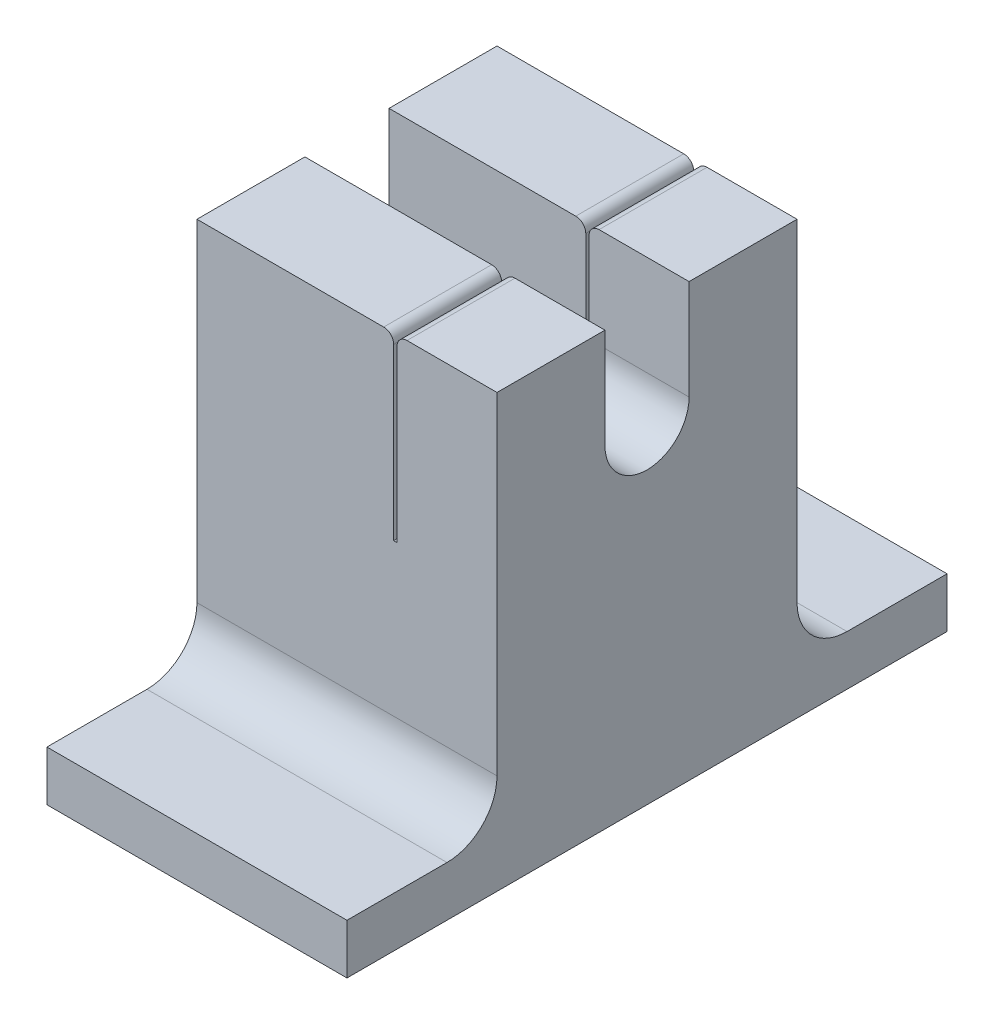
ISO-10303-21;
HEADER;
FILE_DESCRIPTION(('STEP AP214'),'2;1');
FILE_NAME('part.step','',(''),(''),'','','');
FILE_SCHEMA(('AUTOMOTIVE_DESIGN { 1 0 10303 214 1 1 1 1 }'));
ENDSEC;
DATA;
#1=APPLICATION_CONTEXT('core data for automotive mechanical design processes');
#2=APPLICATION_PROTOCOL_DEFINITION('international standard','automotive_design',2000,#1);
#3=PRODUCT_CONTEXT('',#1,'mechanical');
#4=PRODUCT('Part','Part','',(#3));
#5=PRODUCT_RELATED_PRODUCT_CATEGORY('part','',(#4));
#6=PRODUCT_DEFINITION_FORMATION('','',#4);
#7=PRODUCT_DEFINITION_CONTEXT('part definition',#1,'design');
#8=PRODUCT_DEFINITION('design','',#6,#7);
#9=PRODUCT_DEFINITION_SHAPE('','',#8);
#10=(LENGTH_UNIT() NAMED_UNIT(*) SI_UNIT(.MILLI.,.METRE.));
#11=(NAMED_UNIT(*) PLANE_ANGLE_UNIT() SI_UNIT($,.RADIAN.));
#12=(NAMED_UNIT(*) SI_UNIT($,.STERADIAN.) SOLID_ANGLE_UNIT());
#13=UNCERTAINTY_MEASURE_WITH_UNIT(LENGTH_MEASURE(1.E-05),#10,'distance_accuracy_value','');
#14=(GEOMETRIC_REPRESENTATION_CONTEXT(3) GLOBAL_UNCERTAINTY_ASSIGNED_CONTEXT((#13)) GLOBAL_UNIT_ASSIGNED_CONTEXT((#10,
#11,#12)) REPRESENTATION_CONTEXT('',''));
#15=CARTESIAN_POINT('',(0.,0.,0.));
#16=DIRECTION('',(0.,0.,1.));
#17=DIRECTION('',(1.,0.,0.));
#18=AXIS2_PLACEMENT_3D('',#15,#16,#17);
#19=CARTESIAN_POINT('',(15.,33.2,0.));
#20=DIRECTION('',(-1.,0.,0.));
#21=DIRECTION('',(0.,0.,1.));
#22=AXIS2_PLACEMENT_3D('',#19,#20,#21);
#23=CYLINDRICAL_SURFACE('',#22,4.205);
#24=DIRECTION('',(-1.,0.,0.));
#25=VECTOR('',#24,1.);
#26=CARTESIAN_POINT('',(15.,33.2,-4.205));
#27=LINE('',#26,#25);
#28=CARTESIAN_POINT('',(5.,33.2,-4.205));
#29=VERTEX_POINT('',#28);
#30=CARTESIAN_POINT('',(15.,33.2,-4.205));
#31=VERTEX_POINT('',#30);
#32=EDGE_CURVE('E351',#29,#31,#27,.F.);
#33=ORIENTED_EDGE('',*,*,#32,.F.);
#34=CARTESIAN_POINT('',(5.,33.2,0.));
#35=DIRECTION('',(1.,0.,0.));
#36=DIRECTION('',(0.,0.,-1.));
#37=AXIS2_PLACEMENT_3D('',#34,#35,#36);
#38=CIRCLE('',#37,4.205);
#39=CARTESIAN_POINT('',(5.,33.2,4.205));
#40=VERTEX_POINT('',#39);
#41=EDGE_CURVE('E258',#29,#40,#38,.F.);
#42=ORIENTED_EDGE('',*,*,#41,.T.);
#43=DIRECTION('',(-1.,0.,0.));
#44=VECTOR('',#43,1.);
#45=CARTESIAN_POINT('',(15.,33.2,4.205));
#46=LINE('',#45,#44);
#47=CARTESIAN_POINT('',(15.,33.2,4.205));
#48=VERTEX_POINT('',#47);
#49=EDGE_CURVE('E356',#48,#40,#46,.T.);
#50=ORIENTED_EDGE('',*,*,#49,.F.);
#51=CARTESIAN_POINT('',(15.,33.2,0.));
#52=DIRECTION('',(-1.,0.,0.));
#53=DIRECTION('',(0.,0.,1.));
#54=AXIS2_PLACEMENT_3D('',#51,#52,#53);
#55=CIRCLE('',#54,4.205);
#56=EDGE_CURVE('E330',#31,#48,#55,.T.);
#57=ORIENTED_EDGE('',*,*,#56,.F.);
#58=EDGE_LOOP('',(#33,#42,#50,#57));
#59=FACE_BOUND('',#58,.T.);
#60=ADVANCED_FACE('F39',(#59),#23,.F.);
#61=CARTESIAN_POINT('',(-15.,43.2,-4.205));
#62=DIRECTION('',(0.,0.,-1.));
#63=DIRECTION('',(-1.,0.,0.));
#64=AXIS2_PLACEMENT_3D('',#61,#62,#63);
#65=PLANE('',#64);
#66=DIRECTION('',(1.,0.,0.));
#67=VECTOR('',#66,1.);
#68=CARTESIAN_POINT('',(-15.,43.2,-4.205));
#69=LINE('',#68,#67);
#70=CARTESIAN_POINT('',(6.,43.2,-4.205));
#71=VERTEX_POINT('',#70);
#72=CARTESIAN_POINT('',(15.,43.2,-4.205));
#73=VERTEX_POINT('',#72);
#74=EDGE_CURVE('E287',#71,#73,#69,.T.);
#75=ORIENTED_EDGE('',*,*,#74,.F.);
#76=CARTESIAN_POINT('',(6.,42.2,-4.205));
#77=DIRECTION('',(0.,0.,-1.));
#78=DIRECTION('',(-1.,0.,0.));
#79=AXIS2_PLACEMENT_3D('',#76,#77,#78);
#80=CIRCLE('',#79,1.);
#81=CARTESIAN_POINT('',(5.,42.2,-4.205));
#82=VERTEX_POINT('',#81);
#83=EDGE_CURVE('E404',#71,#82,#80,.F.);
#84=ORIENTED_EDGE('',*,*,#83,.T.);
#85=DIRECTION('',(0.,-1.,0.));
#86=VECTOR('',#85,1.);
#87=CARTESIAN_POINT('',(5.,43.2,-4.205));
#88=LINE('',#87,#86);
#89=EDGE_CURVE('E261',#82,#29,#88,.T.);
#90=ORIENTED_EDGE('',*,*,#89,.T.);
#91=ORIENTED_EDGE('',*,*,#32,.T.);
#92=DIRECTION('',(0.,-1.,0.));
#93=VECTOR('',#92,1.);
#94=CARTESIAN_POINT('',(15.,43.2,-4.205));
#95=LINE('',#94,#93);
#96=EDGE_CURVE('E293',#73,#31,#95,.T.);
#97=ORIENTED_EDGE('',*,*,#96,.F.);
#98=EDGE_LOOP('',(#75,#84,#90,#91,#97));
#99=FACE_BOUND('',#98,.T.);
#100=ADVANCED_FACE('F407',(#99),#65,.F.);
#101=CARTESIAN_POINT('',(0.,43.2,0.));
#102=DIRECTION('',(0.,1.,0.));
#103=DIRECTION('',(0.,0.,1.));
#104=AXIS2_PLACEMENT_3D('',#101,#102,#103);
#105=PLANE('',#104);
#106=DIRECTION('',(-1.,0.,0.));
#107=VECTOR('',#106,1.);
#108=CARTESIAN_POINT('',(15.,43.2,-15.));
#109=LINE('',#108,#107);
#110=CARTESIAN_POINT('',(15.,43.2,-15.));
#111=VERTEX_POINT('',#110);
#112=CARTESIAN_POINT('',(6.,43.2,-15.));
#113=VERTEX_POINT('',#112);
#114=EDGE_CURVE('E283',#111,#113,#109,.T.);
#115=ORIENTED_EDGE('',*,*,#114,.T.);
#116=DIRECTION('',(0.,0.,-1.));
#117=VECTOR('',#116,1.);
#118=CARTESIAN_POINT('',(6.,43.2,-4.205));
#119=LINE('',#118,#117);
#120=EDGE_CURVE('E61',#113,#71,#119,.F.);
#121=ORIENTED_EDGE('',*,*,#120,.T.);
#122=ORIENTED_EDGE('',*,*,#74,.T.);
#123=DIRECTION('',(0.,0.,-1.));
#124=VECTOR('',#123,1.);
#125=CARTESIAN_POINT('',(15.,43.2,-4.205));
#126=LINE('',#125,#124);
#127=EDGE_CURVE('E290',#73,#111,#126,.T.);
#128=ORIENTED_EDGE('',*,*,#127,.T.);
#129=EDGE_LOOP('',(#115,#121,#122,#128));
#130=FACE_BOUND('',#129,.T.);
#131=ADVANCED_FACE('F414',(#130),#105,.T.);
#132=CARTESIAN_POINT('',(15.,43.2,4.205));
#133=DIRECTION('',(0.,0.,1.));
#134=DIRECTION('',(1.,0.,0.));
#135=AXIS2_PLACEMENT_3D('',#132,#133,#134);
#136=PLANE('',#135);
#137=DIRECTION('',(0.,1.,0.));
#138=VECTOR('',#137,1.);
#139=CARTESIAN_POINT('',(5.,43.2,4.205));
#140=LINE('',#139,#138);
#141=CARTESIAN_POINT('',(5.,42.2,4.205));
#142=VERTEX_POINT('',#141);
#143=EDGE_CURVE('E255',#40,#142,#140,.T.);
#144=ORIENTED_EDGE('',*,*,#143,.T.);
#145=CARTESIAN_POINT('',(6.,42.2,4.205));
#146=DIRECTION('',(0.,0.,1.));
#147=DIRECTION('',(1.,0.,0.));
#148=AXIS2_PLACEMENT_3D('',#145,#146,#147);
#149=CIRCLE('',#148,1.);
#150=CARTESIAN_POINT('',(6.,43.2,4.205));
#151=VERTEX_POINT('',#150);
#152=EDGE_CURVE('E395',#142,#151,#149,.F.);
#153=ORIENTED_EDGE('',*,*,#152,.T.);
#154=DIRECTION('',(-1.,0.,0.));
#155=VECTOR('',#154,1.);
#156=CARTESIAN_POINT('',(15.,43.2,4.205));
#157=LINE('',#156,#155);
#158=CARTESIAN_POINT('',(15.,43.2,4.205));
#159=VERTEX_POINT('',#158);
#160=EDGE_CURVE('E273',#159,#151,#157,.T.);
#161=ORIENTED_EDGE('',*,*,#160,.F.);
#162=DIRECTION('',(0.,-1.,0.));
#163=VECTOR('',#162,1.);
#164=CARTESIAN_POINT('',(15.,43.2,4.205));
#165=LINE('',#164,#163);
#166=EDGE_CURVE('E263',#159,#48,#165,.T.);
#167=ORIENTED_EDGE('',*,*,#166,.T.);
#168=ORIENTED_EDGE('',*,*,#49,.T.);
#169=EDGE_LOOP('',(#144,#153,#161,#167,#168));
#170=FACE_BOUND('',#169,.T.);
#171=ADVANCED_FACE('F470',(#170),#136,.F.);
#172=CARTESIAN_POINT('',(0.,43.2,0.));
#173=DIRECTION('',(0.,1.,0.));
#174=DIRECTION('',(0.,0.,1.));
#175=AXIS2_PLACEMENT_3D('',#172,#173,#174);
#176=PLANE('',#175);
#177=ORIENTED_EDGE('',*,*,#160,.T.);
#178=DIRECTION('',(0.,0.,-1.));
#179=VECTOR('',#178,1.);
#180=CARTESIAN_POINT('',(6.,43.2,15.));
#181=LINE('',#180,#179);
#182=CARTESIAN_POINT('',(6.00000000000001,43.2,15.));
#183=VERTEX_POINT('',#182);
#184=EDGE_CURVE('E397',#151,#183,#181,.F.);
#185=ORIENTED_EDGE('',*,*,#184,.T.);
#186=DIRECTION('',(1.,0.,0.));
#187=VECTOR('',#186,1.);
#188=CARTESIAN_POINT('',(-15.,43.2,15.));
#189=LINE('',#188,#187);
#190=CARTESIAN_POINT('',(15.,43.2,15.));
#191=VERTEX_POINT('',#190);
#192=EDGE_CURVE('E278',#183,#191,#189,.T.);
#193=ORIENTED_EDGE('',*,*,#192,.T.);
#194=DIRECTION('',(0.,0.,-1.));
#195=VECTOR('',#194,1.);
#196=CARTESIAN_POINT('',(15.,43.2,15.));
#197=LINE('',#196,#195);
#198=EDGE_CURVE('E276',#191,#159,#197,.T.);
#199=ORIENTED_EDGE('',*,*,#198,.T.);
#200=EDGE_LOOP('',(#177,#185,#193,#199));
#201=FACE_BOUND('',#200,.T.);
#202=ADVANCED_FACE('F463',(#201),#176,.T.);
#203=CARTESIAN_POINT('',(-15.,33.2,15.));
#204=DIRECTION('',(1.,0.,0.));
#205=DIRECTION('',(0.,0.,-1.));
#206=AXIS2_PLACEMENT_3D('',#203,#204,#205);
#207=PLANE('',#206);
#208=DIRECTION('',(0.,-1.,0.));
#209=VECTOR('',#208,1.);
#210=CARTESIAN_POINT('',(-15.,33.2,-15.));
#211=LINE('',#210,#209);
#212=CARTESIAN_POINT('',(-15.,43.2,-15.));
#213=VERTEX_POINT('',#212);
#214=CARTESIAN_POINT('',(-15.,10.,-15.));
#215=VERTEX_POINT('',#214);
#216=EDGE_CURVE('E339',#213,#215,#211,.T.);
#217=ORIENTED_EDGE('',*,*,#216,.T.);
#218=CARTESIAN_POINT('',(-15.,10.,-20.));
#219=DIRECTION('',(1.,0.,0.));
#220=DIRECTION('',(0.,0.,-1.));
#221=AXIS2_PLACEMENT_3D('',#218,#219,#220);
#222=CIRCLE('',#221,5.);
#223=CARTESIAN_POINT('',(-15.,5.00000000000001,-20.));
#224=VERTEX_POINT('',#223);
#225=EDGE_CURVE('E369',#215,#224,#222,.T.);
#226=ORIENTED_EDGE('',*,*,#225,.T.);
#227=DIRECTION('',(0.,0.,-1.));
#228=VECTOR('',#227,1.);
#229=CARTESIAN_POINT('',(-15.,5.,30.));
#230=LINE('',#229,#228);
#231=CARTESIAN_POINT('',(-15.,5.00000000000001,-30.));
#232=VERTEX_POINT('',#231);
#233=EDGE_CURVE('E303',#224,#232,#230,.T.);
#234=ORIENTED_EDGE('',*,*,#233,.T.);
#235=DIRECTION('',(0.,-1.,0.));
#236=VECTOR('',#235,1.);
#237=CARTESIAN_POINT('',(-15.,0.,-30.));
#238=LINE('',#237,#236);
#239=CARTESIAN_POINT('',(-15.,0.,-30.));
#240=VERTEX_POINT('',#239);
#241=EDGE_CURVE('E300',#232,#240,#238,.T.);
#242=ORIENTED_EDGE('',*,*,#241,.T.);
#243=DIRECTION('',(0.,0.,1.));
#244=VECTOR('',#243,1.);
#245=CARTESIAN_POINT('',(-15.,0.,15.));
#246=LINE('',#245,#244);
#247=CARTESIAN_POINT('',(-15.,0.,30.));
#248=VERTEX_POINT('',#247);
#249=EDGE_CURVE('E333',#240,#248,#246,.T.);
#250=ORIENTED_EDGE('',*,*,#249,.T.);
#251=DIRECTION('',(0.,1.,0.));
#252=VECTOR('',#251,1.);
#253=CARTESIAN_POINT('',(-15.,0.,30.));
#254=LINE('',#253,#252);
#255=CARTESIAN_POINT('',(-15.,5.,30.));
#256=VERTEX_POINT('',#255);
#257=EDGE_CURVE('E308',#248,#256,#254,.T.);
#258=ORIENTED_EDGE('',*,*,#257,.T.);
#259=CARTESIAN_POINT('',(-15.,5.,20.));
#260=VERTEX_POINT('',#259);
#261=EDGE_CURVE('E305',#256,#260,#230,.T.);
#262=ORIENTED_EDGE('',*,*,#261,.T.);
#263=CARTESIAN_POINT('',(-15.,10.,20.));
#264=DIRECTION('',(1.,0.,0.));
#265=DIRECTION('',(0.,0.,-1.));
#266=AXIS2_PLACEMENT_3D('',#263,#264,#265);
#267=CIRCLE('',#266,5.);
#268=CARTESIAN_POINT('',(-15.,10.,15.));
#269=VERTEX_POINT('',#268);
#270=EDGE_CURVE('E375',#260,#269,#267,.T.);
#271=ORIENTED_EDGE('',*,*,#270,.T.);
#272=DIRECTION('',(0.,-1.,0.));
#273=VECTOR('',#272,1.);
#274=CARTESIAN_POINT('',(-15.,33.2,15.));
#275=LINE('',#274,#273);
#276=CARTESIAN_POINT('',(-15.,43.2,15.));
#277=VERTEX_POINT('',#276);
#278=EDGE_CURVE('E348',#277,#269,#275,.T.);
#279=ORIENTED_EDGE('',*,*,#278,.F.);
#280=DIRECTION('',(0.,0.,1.));
#281=VECTOR('',#280,1.);
#282=CARTESIAN_POINT('',(-15.,43.2,4.205));
#283=LINE('',#282,#281);
#284=CARTESIAN_POINT('',(-15.,43.2,4.205));
#285=VERTEX_POINT('',#284);
#286=EDGE_CURVE('E269',#285,#277,#283,.T.);
#287=ORIENTED_EDGE('',*,*,#286,.F.);
#288=DIRECTION('',(0.,-1.,0.));
#289=VECTOR('',#288,1.);
#290=CARTESIAN_POINT('',(-15.,43.2,4.205));
#291=LINE('',#290,#289);
#292=CARTESIAN_POINT('',(-15.,33.2,4.205));
#293=VERTEX_POINT('',#292);
#294=EDGE_CURVE('E266',#285,#293,#291,.T.);
#295=ORIENTED_EDGE('',*,*,#294,.T.);
#296=CARTESIAN_POINT('',(-15.,33.2,0.));
#297=DIRECTION('',(-1.,0.,0.));
#298=DIRECTION('',(0.,0.,1.));
#299=AXIS2_PLACEMENT_3D('',#296,#297,#298);
#300=CIRCLE('',#299,4.205);
#301=CARTESIAN_POINT('',(-15.,33.2,-4.205));
#302=VERTEX_POINT('',#301);
#303=EDGE_CURVE('E310',#302,#293,#300,.T.);
#304=ORIENTED_EDGE('',*,*,#303,.F.);
#305=DIRECTION('',(0.,-1.,0.));
#306=VECTOR('',#305,1.);
#307=CARTESIAN_POINT('',(-15.,43.2,-4.205));
#308=LINE('',#307,#306);
#309=CARTESIAN_POINT('',(-15.,43.2,-4.205));
#310=VERTEX_POINT('',#309);
#311=EDGE_CURVE('E296',#310,#302,#308,.T.);
#312=ORIENTED_EDGE('',*,*,#311,.F.);
#313=DIRECTION('',(0.,0.,1.));
#314=VECTOR('',#313,1.);
#315=CARTESIAN_POINT('',(-15.,43.2,-15.));
#316=LINE('',#315,#314);
#317=EDGE_CURVE('E285',#213,#310,#316,.T.);
#318=ORIENTED_EDGE('',*,*,#317,.F.);
#319=EDGE_LOOP('',(#217,#226,#234,#242,#250,#258,#262,#271,#279,#287,#295,#304,#312,#318));
#320=FACE_BOUND('',#319,.T.);
#321=ADVANCED_FACE('F426',(#320),#207,.F.);
#322=CARTESIAN_POINT('',(-15.,33.2,15.));
#323=DIRECTION('',(0.,0.,-1.));
#324=DIRECTION('',(-1.,0.,0.));
#325=AXIS2_PLACEMENT_3D('',#322,#323,#324);
#326=PLANE('',#325);
#327=DIRECTION('',(0.,1.,0.));
#328=VECTOR('',#327,1.);
#329=CARTESIAN_POINT('',(4.67,25.2,15.));
#330=LINE('',#329,#328);
#331=CARTESIAN_POINT('',(4.67,25.2,15.));
#332=VERTEX_POINT('',#331);
#333=CARTESIAN_POINT('',(4.67,42.2,15.));
#334=VERTEX_POINT('',#333);
#335=EDGE_CURVE('E245',#332,#334,#330,.T.);
#336=ORIENTED_EDGE('',*,*,#335,.T.);
#337=CARTESIAN_POINT('',(3.67,42.2,15.));
#338=DIRECTION('',(0.,0.,-1.));
#339=DIRECTION('',(-1.,0.,0.));
#340=AXIS2_PLACEMENT_3D('',#337,#338,#339);
#341=CIRCLE('',#340,1.);
#342=CARTESIAN_POINT('',(3.67,43.2,15.));
#343=VERTEX_POINT('',#342);
#344=EDGE_CURVE('E385',#334,#343,#341,.F.);
#345=ORIENTED_EDGE('',*,*,#344,.T.);
#346=EDGE_CURVE('E279',#277,#343,#189,.T.);
#347=ORIENTED_EDGE('',*,*,#346,.F.);
#348=ORIENTED_EDGE('',*,*,#278,.T.);
#349=DIRECTION('',(1.,0.,0.));
#350=VECTOR('',#349,1.);
#351=CARTESIAN_POINT('',(-15.,10.,15.));
#352=LINE('',#351,#350);
#353=CARTESIAN_POINT('',(15.,10.,15.));
#354=VERTEX_POINT('',#353);
#355=EDGE_CURVE('E364',#269,#354,#352,.T.);
#356=ORIENTED_EDGE('',*,*,#355,.T.);
#357=DIRECTION('',(0.,-1.,0.));
#358=VECTOR('',#357,1.);
#359=CARTESIAN_POINT('',(15.,33.2,15.));
#360=LINE('',#359,#358);
#361=EDGE_CURVE('E345',#191,#354,#360,.T.);
#362=ORIENTED_EDGE('',*,*,#361,.F.);
#363=ORIENTED_EDGE('',*,*,#192,.F.);
#364=CARTESIAN_POINT('',(6.,42.2,15.));
#365=DIRECTION('',(0.,0.,-1.));
#366=DIRECTION('',(-1.,0.,0.));
#367=AXIS2_PLACEMENT_3D('',#364,#365,#366);
#368=CIRCLE('',#367,1.);
#369=CARTESIAN_POINT('',(5.,42.2,15.));
#370=VERTEX_POINT('',#369);
#371=EDGE_CURVE('E383',#183,#370,#368,.F.);
#372=ORIENTED_EDGE('',*,*,#371,.T.);
#373=DIRECTION('',(0.,1.,0.));
#374=VECTOR('',#373,1.);
#375=CARTESIAN_POINT('',(5.,25.2,15.));
#376=LINE('',#375,#374);
#377=CARTESIAN_POINT('',(5.,25.2,15.));
#378=VERTEX_POINT('',#377);
#379=EDGE_CURVE('E242',#378,#370,#376,.T.);
#380=ORIENTED_EDGE('',*,*,#379,.F.);
#381=DIRECTION('',(1.,0.,0.));
#382=VECTOR('',#381,1.);
#383=CARTESIAN_POINT('',(4.67,25.2,15.));
#384=LINE('',#383,#382);
#385=EDGE_CURVE('E224',#332,#378,#384,.T.);
#386=ORIENTED_EDGE('',*,*,#385,.F.);
#387=EDGE_LOOP('',(#336,#345,#347,#348,#356,#362,#363,#372,#380,#386));
#388=FACE_BOUND('',#387,.T.);
#389=ADVANCED_FACE('F456',(#388),#326,.F.);
#390=CARTESIAN_POINT('',(15.,33.2,15.));
#391=DIRECTION('',(-1.,0.,0.));
#392=DIRECTION('',(0.,0.,1.));
#393=AXIS2_PLACEMENT_3D('',#390,#391,#392);
#394=PLANE('',#393);
#395=ORIENTED_EDGE('',*,*,#361,.T.);
#396=CARTESIAN_POINT('',(15.,10.,20.));
#397=DIRECTION('',(-1.,0.,0.));
#398=DIRECTION('',(0.,0.,1.));
#399=AXIS2_PLACEMENT_3D('',#396,#397,#398);
#400=CIRCLE('',#399,5.);
#401=CARTESIAN_POINT('',(15.,5.,20.));
#402=VERTEX_POINT('',#401);
#403=EDGE_CURVE('E373',#354,#402,#400,.T.);
#404=ORIENTED_EDGE('',*,*,#403,.T.);
#405=DIRECTION('',(0.,0.,1.));
#406=VECTOR('',#405,1.);
#407=CARTESIAN_POINT('',(15.,5.,30.));
#408=LINE('',#407,#406);
#409=CARTESIAN_POINT('',(15.,5.,30.));
#410=VERTEX_POINT('',#409);
#411=EDGE_CURVE('E316',#402,#410,#408,.T.);
#412=ORIENTED_EDGE('',*,*,#411,.T.);
#413=DIRECTION('',(0.,-1.,0.));
#414=VECTOR('',#413,1.);
#415=CARTESIAN_POINT('',(15.,0.,30.));
#416=LINE('',#415,#414);
#417=CARTESIAN_POINT('',(15.,0.,30.));
#418=VERTEX_POINT('',#417);
#419=EDGE_CURVE('E299',#410,#418,#416,.T.);
#420=ORIENTED_EDGE('',*,*,#419,.T.);
#421=DIRECTION('',(0.,0.,-1.));
#422=VECTOR('',#421,1.);
#423=CARTESIAN_POINT('',(15.,0.,15.));
#424=LINE('',#423,#422);
#425=CARTESIAN_POINT('',(15.,0.,-30.));
#426=VERTEX_POINT('',#425);
#427=EDGE_CURVE('E337',#418,#426,#424,.T.);
#428=ORIENTED_EDGE('',*,*,#427,.T.);
#429=DIRECTION('',(0.,1.,0.));
#430=VECTOR('',#429,1.);
#431=CARTESIAN_POINT('',(15.,0.,-30.));
#432=LINE('',#431,#430);
#433=CARTESIAN_POINT('',(15.,5.00000000000001,-30.));
#434=VERTEX_POINT('',#433);
#435=EDGE_CURVE('E313',#426,#434,#432,.T.);
#436=ORIENTED_EDGE('',*,*,#435,.T.);
#437=CARTESIAN_POINT('',(15.,5.00000000000001,-20.));
#438=VERTEX_POINT('',#437);
#439=EDGE_CURVE('E317',#434,#438,#408,.T.);
#440=ORIENTED_EDGE('',*,*,#439,.T.);
#441=CARTESIAN_POINT('',(15.,10.,-20.));
#442=DIRECTION('',(-1.,0.,0.));
#443=DIRECTION('',(0.,0.,1.));
#444=AXIS2_PLACEMENT_3D('',#441,#442,#443);
#445=CIRCLE('',#444,5.);
#446=CARTESIAN_POINT('',(15.,10.,-15.));
#447=VERTEX_POINT('',#446);
#448=EDGE_CURVE('E371',#438,#447,#445,.T.);
#449=ORIENTED_EDGE('',*,*,#448,.T.);
#450=DIRECTION('',(0.,-1.,0.));
#451=VECTOR('',#450,1.);
#452=CARTESIAN_POINT('',(15.,33.2,-15.));
#453=LINE('',#452,#451);
#454=EDGE_CURVE('E342',#111,#447,#453,.T.);
#455=ORIENTED_EDGE('',*,*,#454,.F.);
#456=ORIENTED_EDGE('',*,*,#127,.F.);
#457=ORIENTED_EDGE('',*,*,#96,.T.);
#458=ORIENTED_EDGE('',*,*,#56,.T.);
#459=ORIENTED_EDGE('',*,*,#166,.F.);
#460=ORIENTED_EDGE('',*,*,#198,.F.);
#461=EDGE_LOOP('',(#395,#404,#412,#420,#428,#436,#440,#449,#455,#456,#457,#458,#459,#460));
#462=FACE_BOUND('',#461,.T.);
#463=ADVANCED_FACE('F417',(#462),#394,.F.);
#464=CARTESIAN_POINT('',(-15.,33.2,-15.));
#465=DIRECTION('',(0.,0.,1.));
#466=DIRECTION('',(1.,0.,0.));
#467=AXIS2_PLACEMENT_3D('',#464,#465,#466);
#468=PLANE('',#467);
#469=DIRECTION('',(0.,1.,0.));
#470=VECTOR('',#469,1.);
#471=CARTESIAN_POINT('',(5.,25.2,-15.));
#472=LINE('',#471,#470);
#473=CARTESIAN_POINT('',(5.,25.2,-15.));
#474=VERTEX_POINT('',#473);
#475=CARTESIAN_POINT('',(5.,42.2,-15.));
#476=VERTEX_POINT('',#475);
#477=EDGE_CURVE('E212',#474,#476,#472,.T.);
#478=ORIENTED_EDGE('',*,*,#477,.T.);
#479=CARTESIAN_POINT('',(6.,42.2,-15.));
#480=DIRECTION('',(0.,0.,1.));
#481=DIRECTION('',(1.,0.,0.));
#482=AXIS2_PLACEMENT_3D('',#479,#480,#481);
#483=CIRCLE('',#482,1.);
#484=EDGE_CURVE('E401',#476,#113,#483,.F.);
#485=ORIENTED_EDGE('',*,*,#484,.T.);
#486=ORIENTED_EDGE('',*,*,#114,.F.);
#487=ORIENTED_EDGE('',*,*,#454,.T.);
#488=DIRECTION('',(-1.,0.,0.));
#489=VECTOR('',#488,1.);
#490=CARTESIAN_POINT('',(-15.,10.,-15.));
#491=LINE('',#490,#489);
#492=EDGE_CURVE('E359',#447,#215,#491,.T.);
#493=ORIENTED_EDGE('',*,*,#492,.T.);
#494=ORIENTED_EDGE('',*,*,#216,.F.);
#495=CARTESIAN_POINT('',(3.67,43.2,-15.));
#496=VERTEX_POINT('',#495);
#497=EDGE_CURVE('E282',#496,#213,#109,.T.);
#498=ORIENTED_EDGE('',*,*,#497,.F.);
#499=CARTESIAN_POINT('',(3.67,42.2,-15.));
#500=DIRECTION('',(0.,0.,1.));
#501=DIRECTION('',(1.,0.,0.));
#502=AXIS2_PLACEMENT_3D('',#499,#500,#501);
#503=CIRCLE('',#502,1.);
#504=CARTESIAN_POINT('',(4.67,42.2,-15.));
#505=VERTEX_POINT('',#504);
#506=EDGE_CURVE('E399',#496,#505,#503,.F.);
#507=ORIENTED_EDGE('',*,*,#506,.T.);
#508=DIRECTION('',(0.,1.,0.));
#509=VECTOR('',#508,1.);
#510=CARTESIAN_POINT('',(4.67,25.2,-15.));
#511=LINE('',#510,#509);
#512=CARTESIAN_POINT('',(4.67,25.2,-15.));
#513=VERTEX_POINT('',#512);
#514=EDGE_CURVE('E223',#513,#505,#511,.T.);
#515=ORIENTED_EDGE('',*,*,#514,.F.);
#516=DIRECTION('',(-1.,0.,0.));
#517=VECTOR('',#516,1.);
#518=CARTESIAN_POINT('',(4.67,25.2,-15.));
#519=LINE('',#518,#517);
#520=EDGE_CURVE('E230',#474,#513,#519,.T.);
#521=ORIENTED_EDGE('',*,*,#520,.F.);
#522=EDGE_LOOP('',(#478,#485,#486,#487,#493,#494,#498,#507,#515,#521));
#523=FACE_BOUND('',#522,.T.);
#524=ADVANCED_FACE('F235',(#523),#468,.F.);
#525=CARTESIAN_POINT('',(0.,0.,0.));
#526=DIRECTION('',(0.,-1.,0.));
#527=DIRECTION('',(0.,0.,-1.));
#528=AXIS2_PLACEMENT_3D('',#525,#526,#527);
#529=PLANE('',#528);
#530=ORIENTED_EDGE('',*,*,#249,.F.);
#531=DIRECTION('',(1.,0.,0.));
#532=VECTOR('',#531,1.);
#533=CARTESIAN_POINT('',(-75.2079728939615,0.,-30.));
#534=LINE('',#533,#532);
#535=EDGE_CURVE('E325',#240,#426,#534,.T.);
#536=ORIENTED_EDGE('',*,*,#535,.T.);
#537=ORIENTED_EDGE('',*,*,#427,.F.);
#538=DIRECTION('',(1.,0.,0.));
#539=VECTOR('',#538,1.);
#540=CARTESIAN_POINT('',(-75.2079728939615,0.,30.));
#541=LINE('',#540,#539);
#542=EDGE_CURVE('E320',#248,#418,#541,.T.);
#543=ORIENTED_EDGE('',*,*,#542,.F.);
#544=EDGE_LOOP('',(#530,#536,#537,#543));
#545=FACE_BOUND('',#544,.T.);
#546=ADVANCED_FACE('F440',(#545),#529,.T.);
#547=CARTESIAN_POINT('',(4.67,33.2,4.205));
#548=VERTEX_POINT('',#547);
#549=EDGE_CURVE('E355',#548,#293,#46,.T.);
#550=ORIENTED_EDGE('',*,*,#549,.F.);
#551=CARTESIAN_POINT('',(4.67,33.2,0.));
#552=DIRECTION('',(-1.,0.,0.));
#553=DIRECTION('',(0.,0.,1.));
#554=AXIS2_PLACEMENT_3D('',#551,#552,#553);
#555=CIRCLE('',#554,4.205);
#556=CARTESIAN_POINT('',(4.67,33.2,-4.205));
#557=VERTEX_POINT('',#556);
#558=EDGE_CURVE('E250',#548,#557,#555,.F.);
#559=ORIENTED_EDGE('',*,*,#558,.T.);
#560=EDGE_CURVE('E352',#302,#557,#27,.F.);
#561=ORIENTED_EDGE('',*,*,#560,.F.);
#562=ORIENTED_EDGE('',*,*,#303,.T.);
#563=EDGE_LOOP('',(#550,#559,#561,#562));
#564=FACE_BOUND('',#563,.T.);
#565=ADVANCED_FACE('F475',(#564),#23,.F.);
#566=CARTESIAN_POINT('',(-75.2079728939615,0.,-30.));
#567=DIRECTION('',(0.,0.,-1.));
#568=DIRECTION('',(-1.,0.,0.));
#569=AXIS2_PLACEMENT_3D('',#566,#567,#568);
#570=PLANE('',#569);
#571=ORIENTED_EDGE('',*,*,#241,.F.);
#572=DIRECTION('',(1.,0.,0.));
#573=VECTOR('',#572,1.);
#574=CARTESIAN_POINT('',(-75.2079728939615,5.00000000000001,-30.));
#575=LINE('',#574,#573);
#576=EDGE_CURVE('E323',#232,#434,#575,.T.);
#577=ORIENTED_EDGE('',*,*,#576,.T.);
#578=ORIENTED_EDGE('',*,*,#435,.F.);
#579=ORIENTED_EDGE('',*,*,#535,.F.);
#580=EDGE_LOOP('',(#571,#577,#578,#579));
#581=FACE_BOUND('',#580,.T.);
#582=ADVANCED_FACE('F435',(#581),#570,.T.);
#583=CARTESIAN_POINT('',(-75.2079728939615,5.,30.));
#584=DIRECTION('',(0.,1.,0.));
#585=DIRECTION('',(0.,0.,1.));
#586=AXIS2_PLACEMENT_3D('',#583,#584,#585);
#587=PLANE('',#586);
#588=ORIENTED_EDGE('',*,*,#233,.F.);
#589=DIRECTION('',(-1.,0.,0.));
#590=VECTOR('',#589,1.);
#591=CARTESIAN_POINT('',(-75.2079728939615,5.00000000000001,-20.));
#592=LINE('',#591,#590);
#593=EDGE_CURVE('E362',#224,#438,#592,.F.);
#594=ORIENTED_EDGE('',*,*,#593,.T.);
#595=ORIENTED_EDGE('',*,*,#439,.F.);
#596=ORIENTED_EDGE('',*,*,#576,.F.);
#597=EDGE_LOOP('',(#588,#594,#595,#596));
#598=FACE_BOUND('',#597,.T.);
#599=ADVANCED_FACE('F431',(#598),#587,.T.);
#600=ORIENTED_EDGE('',*,*,#411,.F.);
#601=DIRECTION('',(1.,0.,0.));
#602=VECTOR('',#601,1.);
#603=CARTESIAN_POINT('',(-75.2079728939615,5.,20.));
#604=LINE('',#603,#602);
#605=EDGE_CURVE('E367',#402,#260,#604,.F.);
#606=ORIENTED_EDGE('',*,*,#605,.T.);
#607=ORIENTED_EDGE('',*,*,#261,.F.);
#608=DIRECTION('',(1.,0.,0.));
#609=VECTOR('',#608,1.);
#610=CARTESIAN_POINT('',(-75.2079728939615,5.,30.));
#611=LINE('',#610,#609);
#612=EDGE_CURVE('E304',#256,#410,#611,.T.);
#613=ORIENTED_EDGE('',*,*,#612,.T.);
#614=EDGE_LOOP('',(#600,#606,#607,#613));
#615=FACE_BOUND('',#614,.T.);
#616=ADVANCED_FACE('F448',(#615),#587,.T.);
#617=CARTESIAN_POINT('',(-75.2079728939615,0.,30.));
#618=DIRECTION('',(0.,0.,1.));
#619=DIRECTION('',(1.,0.,0.));
#620=AXIS2_PLACEMENT_3D('',#617,#618,#619);
#621=PLANE('',#620);
#622=ORIENTED_EDGE('',*,*,#257,.F.);
#623=ORIENTED_EDGE('',*,*,#542,.T.);
#624=ORIENTED_EDGE('',*,*,#419,.F.);
#625=ORIENTED_EDGE('',*,*,#612,.F.);
#626=EDGE_LOOP('',(#622,#623,#624,#625));
#627=FACE_BOUND('',#626,.T.);
#628=ADVANCED_FACE('F445',(#627),#621,.T.);
#629=CARTESIAN_POINT('',(-15.,10.,-20.));
#630=DIRECTION('',(-1.,0.,0.));
#631=DIRECTION('',(0.,0.,1.));
#632=AXIS2_PLACEMENT_3D('',#629,#630,#631);
#633=CYLINDRICAL_SURFACE('',#632,5.);
#634=ORIENTED_EDGE('',*,*,#448,.F.);
#635=ORIENTED_EDGE('',*,*,#593,.F.);
#636=ORIENTED_EDGE('',*,*,#225,.F.);
#637=ORIENTED_EDGE('',*,*,#492,.F.);
#638=EDGE_LOOP('',(#634,#635,#636,#637));
#639=FACE_BOUND('',#638,.T.);
#640=ADVANCED_FACE('F422',(#639),#633,.F.);
#641=CARTESIAN_POINT('',(-15.,10.,20.));
#642=DIRECTION('',(1.,0.,0.));
#643=DIRECTION('',(0.,0.,-1.));
#644=AXIS2_PLACEMENT_3D('',#641,#642,#643);
#645=CYLINDRICAL_SURFACE('',#644,5.);
#646=ORIENTED_EDGE('',*,*,#270,.F.);
#647=ORIENTED_EDGE('',*,*,#605,.F.);
#648=ORIENTED_EDGE('',*,*,#403,.F.);
#649=ORIENTED_EDGE('',*,*,#355,.F.);
#650=EDGE_LOOP('',(#646,#647,#648,#649));
#651=FACE_BOUND('',#650,.T.);
#652=ADVANCED_FACE('F453',(#651),#645,.F.);
#653=DIRECTION('',(0.,1.,0.));
#654=VECTOR('',#653,1.);
#655=CARTESIAN_POINT('',(4.67,43.2,-4.205));
#656=LINE('',#655,#654);
#657=CARTESIAN_POINT('',(4.67,42.2,-4.205));
#658=VERTEX_POINT('',#657);
#659=EDGE_CURVE('E253',#557,#658,#656,.T.);
#660=ORIENTED_EDGE('',*,*,#659,.T.);
#661=CARTESIAN_POINT('',(3.67,42.2,-4.205));
#662=DIRECTION('',(0.,0.,-1.));
#663=DIRECTION('',(-1.,0.,0.));
#664=AXIS2_PLACEMENT_3D('',#661,#662,#663);
#665=CIRCLE('',#664,1.);
#666=CARTESIAN_POINT('',(3.67,43.2,-4.205));
#667=VERTEX_POINT('',#666);
#668=EDGE_CURVE('E47',#658,#667,#665,.F.);
#669=ORIENTED_EDGE('',*,*,#668,.T.);
#670=EDGE_CURVE('E288',#310,#667,#69,.T.);
#671=ORIENTED_EDGE('',*,*,#670,.F.);
#672=ORIENTED_EDGE('',*,*,#311,.T.);
#673=ORIENTED_EDGE('',*,*,#560,.T.);
#674=EDGE_LOOP('',(#660,#669,#671,#672,#673));
#675=FACE_BOUND('',#674,.T.);
#676=ADVANCED_FACE('F482',(#675),#65,.F.);
#677=ORIENTED_EDGE('',*,*,#670,.T.);
#678=DIRECTION('',(0.,0.,1.));
#679=VECTOR('',#678,1.);
#680=CARTESIAN_POINT('',(3.67,43.2,-15.));
#681=LINE('',#680,#679);
#682=EDGE_CURVE('E11',#667,#496,#681,.F.);
#683=ORIENTED_EDGE('',*,*,#682,.T.);
#684=ORIENTED_EDGE('',*,*,#497,.T.);
#685=ORIENTED_EDGE('',*,*,#317,.T.);
#686=EDGE_LOOP('',(#677,#683,#684,#685));
#687=FACE_BOUND('',#686,.T.);
#688=ADVANCED_FACE('F517',(#687),#105,.T.);
#689=CARTESIAN_POINT('',(3.67,43.2,4.205));
#690=VERTEX_POINT('',#689);
#691=EDGE_CURVE('E272',#690,#285,#157,.T.);
#692=ORIENTED_EDGE('',*,*,#691,.F.);
#693=CARTESIAN_POINT('',(3.67,42.2,4.205));
#694=DIRECTION('',(0.,0.,1.));
#695=DIRECTION('',(1.,0.,0.));
#696=AXIS2_PLACEMENT_3D('',#693,#694,#695);
#697=CIRCLE('',#696,1.);
#698=CARTESIAN_POINT('',(4.67,42.2,4.205));
#699=VERTEX_POINT('',#698);
#700=EDGE_CURVE('E389',#690,#699,#697,.F.);
#701=ORIENTED_EDGE('',*,*,#700,.T.);
#702=DIRECTION('',(0.,-1.,0.));
#703=VECTOR('',#702,1.);
#704=CARTESIAN_POINT('',(4.67,43.2,4.205));
#705=LINE('',#704,#703);
#706=EDGE_CURVE('E244',#699,#548,#705,.T.);
#707=ORIENTED_EDGE('',*,*,#706,.T.);
#708=ORIENTED_EDGE('',*,*,#549,.T.);
#709=ORIENTED_EDGE('',*,*,#294,.F.);
#710=EDGE_LOOP('',(#692,#701,#707,#708,#709));
#711=FACE_BOUND('',#710,.T.);
#712=ADVANCED_FACE('F498',(#711),#136,.F.);
#713=ORIENTED_EDGE('',*,*,#346,.T.);
#714=DIRECTION('',(0.,0.,1.));
#715=VECTOR('',#714,1.);
#716=CARTESIAN_POINT('',(3.67,43.2,4.205));
#717=LINE('',#716,#715);
#718=EDGE_CURVE('E387',#343,#690,#717,.F.);
#719=ORIENTED_EDGE('',*,*,#718,.T.);
#720=ORIENTED_EDGE('',*,*,#691,.T.);
#721=ORIENTED_EDGE('',*,*,#286,.T.);
#722=EDGE_LOOP('',(#713,#719,#720,#721));
#723=FACE_BOUND('',#722,.T.);
#724=ADVANCED_FACE('F508',(#723),#176,.T.);
#725=CARTESIAN_POINT('',(5.,25.2,-15.));
#726=DIRECTION('',(1.,0.,0.));
#727=DIRECTION('',(0.,0.,-1.));
#728=AXIS2_PLACEMENT_3D('',#725,#726,#727);
#729=PLANE('',#728);
#730=ORIENTED_EDGE('',*,*,#379,.T.);
#731=DIRECTION('',(0.,0.,-1.));
#732=VECTOR('',#731,1.);
#733=CARTESIAN_POINT('',(5.,42.2,4.205));
#734=LINE('',#733,#732);
#735=EDGE_CURVE('E392',#370,#142,#734,.T.);
#736=ORIENTED_EDGE('',*,*,#735,.T.);
#737=ORIENTED_EDGE('',*,*,#143,.F.);
#738=ORIENTED_EDGE('',*,*,#41,.F.);
#739=ORIENTED_EDGE('',*,*,#89,.F.);
#740=DIRECTION('',(0.,0.,-1.));
#741=VECTOR('',#740,1.);
#742=CARTESIAN_POINT('',(5.,42.2,-15.));
#743=LINE('',#742,#741);
#744=EDGE_CURVE('E220',#82,#476,#743,.T.);
#745=ORIENTED_EDGE('',*,*,#744,.T.);
#746=ORIENTED_EDGE('',*,*,#477,.F.);
#747=DIRECTION('',(0.,0.,-1.));
#748=VECTOR('',#747,1.);
#749=CARTESIAN_POINT('',(5.,25.2,-15.));
#750=LINE('',#749,#748);
#751=EDGE_CURVE('E216',#378,#474,#750,.T.);
#752=ORIENTED_EDGE('',*,*,#751,.F.);
#753=EDGE_LOOP('',(#730,#736,#737,#738,#739,#745,#746,#752));
#754=FACE_BOUND('',#753,.T.);
#755=ADVANCED_FACE('F215',(#754),#729,.F.);
#756=CARTESIAN_POINT('',(4.67,25.2,-15.));
#757=DIRECTION('',(-1.,0.,0.));
#758=DIRECTION('',(0.,0.,1.));
#759=AXIS2_PLACEMENT_3D('',#756,#757,#758);
#760=PLANE('',#759);
#761=ORIENTED_EDGE('',*,*,#706,.F.);
#762=DIRECTION('',(0.,0.,1.));
#763=VECTOR('',#762,1.);
#764=CARTESIAN_POINT('',(4.67,42.2,15.));
#765=LINE('',#764,#763);
#766=EDGE_CURVE('E380',#699,#334,#765,.T.);
#767=ORIENTED_EDGE('',*,*,#766,.T.);
#768=ORIENTED_EDGE('',*,*,#335,.F.);
#769=DIRECTION('',(0.,0.,1.));
#770=VECTOR('',#769,1.);
#771=CARTESIAN_POINT('',(4.67,25.2,-15.));
#772=LINE('',#771,#770);
#773=EDGE_CURVE('E237',#513,#332,#772,.T.);
#774=ORIENTED_EDGE('',*,*,#773,.F.);
#775=ORIENTED_EDGE('',*,*,#514,.T.);
#776=DIRECTION('',(0.,0.,1.));
#777=VECTOR('',#776,1.);
#778=CARTESIAN_POINT('',(4.67,42.2,-4.205));
#779=LINE('',#778,#777);
#780=EDGE_CURVE('E377',#505,#658,#779,.T.);
#781=ORIENTED_EDGE('',*,*,#780,.T.);
#782=ORIENTED_EDGE('',*,*,#659,.F.);
#783=ORIENTED_EDGE('',*,*,#558,.F.);
#784=EDGE_LOOP('',(#761,#767,#768,#774,#775,#781,#782,#783));
#785=FACE_BOUND('',#784,.T.);
#786=ADVANCED_FACE('F504',(#785),#760,.F.);
#787=CARTESIAN_POINT('',(0.,25.2,0.));
#788=DIRECTION('',(0.,1.,0.));
#789=DIRECTION('',(0.,0.,1.));
#790=AXIS2_PLACEMENT_3D('',#787,#788,#789);
#791=PLANE('',#790);
#792=ORIENTED_EDGE('',*,*,#751,.T.);
#793=ORIENTED_EDGE('',*,*,#520,.T.);
#794=ORIENTED_EDGE('',*,*,#773,.T.);
#795=ORIENTED_EDGE('',*,*,#385,.T.);
#796=EDGE_LOOP('',(#792,#793,#794,#795));
#797=FACE_BOUND('',#796,.T.);
#798=ADVANCED_FACE('F228',(#797),#791,.T.);
#799=CARTESIAN_POINT('',(3.67,42.2,-15.));
#800=DIRECTION('',(0.,0.,-1.));
#801=DIRECTION('',(-1.,0.,0.));
#802=AXIS2_PLACEMENT_3D('',#799,#800,#801);
#803=CYLINDRICAL_SURFACE('',#802,1.);
#804=ORIENTED_EDGE('',*,*,#700,.F.);
#805=ORIENTED_EDGE('',*,*,#718,.F.);
#806=ORIENTED_EDGE('',*,*,#344,.F.);
#807=ORIENTED_EDGE('',*,*,#766,.F.);
#808=EDGE_LOOP('',(#804,#805,#806,#807));
#809=FACE_BOUND('',#808,.T.);
#810=ADVANCED_FACE('F511',(#809),#803,.T.);
#811=CARTESIAN_POINT('',(6.,42.2,-15.));
#812=DIRECTION('',(0.,0.,1.));
#813=DIRECTION('',(1.,0.,0.));
#814=AXIS2_PLACEMENT_3D('',#811,#812,#813);
#815=CYLINDRICAL_SURFACE('',#814,1.);
#816=ORIENTED_EDGE('',*,*,#371,.F.);
#817=ORIENTED_EDGE('',*,*,#184,.F.);
#818=ORIENTED_EDGE('',*,*,#152,.F.);
#819=ORIENTED_EDGE('',*,*,#735,.F.);
#820=EDGE_LOOP('',(#816,#817,#818,#819));
#821=FACE_BOUND('',#820,.T.);
#822=ADVANCED_FACE('F468',(#821),#815,.T.);
#823=CARTESIAN_POINT('',(6.,42.2,-15.));
#824=DIRECTION('',(0.,0.,1.));
#825=DIRECTION('',(1.,0.,0.));
#826=AXIS2_PLACEMENT_3D('',#823,#824,#825);
#827=CYLINDRICAL_SURFACE('',#826,1.);
#828=ORIENTED_EDGE('',*,*,#83,.F.);
#829=ORIENTED_EDGE('',*,*,#120,.F.);
#830=ORIENTED_EDGE('',*,*,#484,.F.);
#831=ORIENTED_EDGE('',*,*,#744,.F.);
#832=EDGE_LOOP('',(#828,#829,#830,#831));
#833=FACE_BOUND('',#832,.T.);
#834=ADVANCED_FACE('F412',(#833),#827,.T.);
#835=CARTESIAN_POINT('',(3.67,42.2,-15.));
#836=DIRECTION('',(0.,0.,-1.));
#837=DIRECTION('',(-1.,0.,0.));
#838=AXIS2_PLACEMENT_3D('',#835,#836,#837);
#839=CYLINDRICAL_SURFACE('',#838,1.);
#840=ORIENTED_EDGE('',*,*,#506,.F.);
#841=ORIENTED_EDGE('',*,*,#682,.F.);
#842=ORIENTED_EDGE('',*,*,#668,.F.);
#843=ORIENTED_EDGE('',*,*,#780,.F.);
#844=EDGE_LOOP('',(#840,#841,#842,#843));
#845=FACE_BOUND('',#844,.T.);
#846=ADVANCED_FACE('F41',(#845),#839,.T.);
#847=CLOSED_SHELL('',(#60,#100,#131,#171,#202,#321,#389,#463,#524,#546,#565,#582,#599,#616,#628,
#640,#652,#676,#688,#712,#724,#755,#786,#798,#810,#822,#834,#846));
#848=MANIFOLD_SOLID_BREP('B2',#847);
#849=ADVANCED_BREP_SHAPE_REPRESENTATION('',(#18,#848),#14);
#850=SHAPE_DEFINITION_REPRESENTATION(#9,#849);
ENDSEC;
END-ISO-10303-21;
